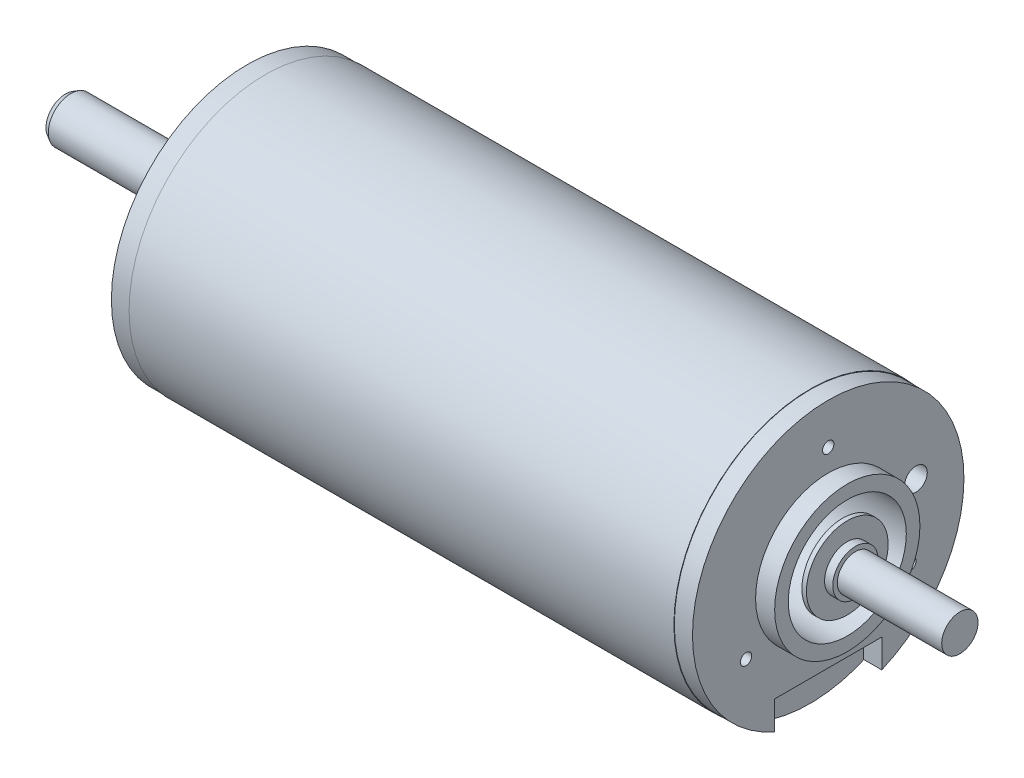
ISO-10303-21;
HEADER;
FILE_DESCRIPTION(('STEP AP214'),'2;1');
FILE_NAME('part.step','',(''),(''),'','','');
FILE_SCHEMA(('AUTOMOTIVE_DESIGN { 1 0 10303 214 1 1 1 1 }'));
ENDSEC;
DATA;
#1=APPLICATION_CONTEXT('core data for automotive mechanical design processes');
#2=APPLICATION_PROTOCOL_DEFINITION('international standard','automotive_design',2000,#1);
#3=PRODUCT_CONTEXT('',#1,'mechanical');
#4=PRODUCT('Part','Part','',(#3));
#5=PRODUCT_RELATED_PRODUCT_CATEGORY('part','',(#4));
#6=PRODUCT_DEFINITION_FORMATION('','',#4);
#7=PRODUCT_DEFINITION_CONTEXT('part definition',#1,'design');
#8=PRODUCT_DEFINITION('design','',#6,#7);
#9=PRODUCT_DEFINITION_SHAPE('','',#8);
#10=(LENGTH_UNIT() NAMED_UNIT(*) SI_UNIT(.MILLI.,.METRE.));
#11=(NAMED_UNIT(*) PLANE_ANGLE_UNIT() SI_UNIT($,.RADIAN.));
#12=(NAMED_UNIT(*) SI_UNIT($,.STERADIAN.) SOLID_ANGLE_UNIT());
#13=UNCERTAINTY_MEASURE_WITH_UNIT(LENGTH_MEASURE(1.E-05),#10,'distance_accuracy_value','');
#14=(GEOMETRIC_REPRESENTATION_CONTEXT(3) GLOBAL_UNCERTAINTY_ASSIGNED_CONTEXT((#13)) GLOBAL_UNIT_ASSIGNED_CONTEXT((#10,
#11,#12)) REPRESENTATION_CONTEXT('',''));
#15=CARTESIAN_POINT('',(0.,0.,0.));
#16=DIRECTION('',(0.,0.,1.));
#17=DIRECTION('',(1.,0.,0.));
#18=AXIS2_PLACEMENT_3D('',#15,#16,#17);
#19=CARTESIAN_POINT('',(78.5,0.,0.));
#20=DIRECTION('',(-1.,0.,0.));
#21=DIRECTION('',(0.,0.,1.));
#22=AXIS2_PLACEMENT_3D('',#19,#20,#21);
#23=CYLINDRICAL_SURFACE('',#22,2.);
#24=CARTESIAN_POINT('',(78.5,0.,0.));
#25=DIRECTION('',(-1.,0.,0.));
#26=DIRECTION('',(0.,0.,1.));
#27=AXIS2_PLACEMENT_3D('',#24,#25,#26);
#28=CIRCLE('',#27,2.);
#29=CARTESIAN_POINT('',(78.5,0.,2.));
#30=VERTEX_POINT('',#29);
#31=EDGE_CURVE('E11',#30,#30,#28,.T.);
#32=ORIENTED_EDGE('',*,*,#31,.T.);
#33=EDGE_LOOP('',(#32));
#34=FACE_BOUND('',#33,.T.);
#35=CARTESIAN_POINT('',(67.,0.,0.));
#36=DIRECTION('',(-1.,0.,0.));
#37=DIRECTION('',(0.,0.,1.));
#38=AXIS2_PLACEMENT_3D('',#35,#36,#37);
#39=CIRCLE('',#38,2.);
#40=CARTESIAN_POINT('',(67.,0.,2.));
#41=VERTEX_POINT('',#40);
#42=EDGE_CURVE('E63',#41,#41,#39,.T.);
#43=ORIENTED_EDGE('',*,*,#42,.F.);
#44=EDGE_LOOP('',(#43));
#45=FACE_BOUND('',#44,.T.);
#46=ADVANCED_FACE('F41',(#34,#45),#23,.T.);
#47=CARTESIAN_POINT('',(78.5,1.99999999999999,0.));
#48=DIRECTION('',(1.,0.,0.));
#49=DIRECTION('',(0.,0.,-1.));
#50=AXIS2_PLACEMENT_3D('',#47,#48,#49);
#51=PLANE('',#50);
#52=ORIENTED_EDGE('',*,*,#31,.F.);
#53=EDGE_LOOP('',(#52));
#54=FACE_BOUND('',#53,.T.);
#55=ADVANCED_FACE('F71',(#54),#51,.T.);
#56=CARTESIAN_POINT('',(65.6,0.,0.));
#57=DIRECTION('',(-1.,0.,0.));
#58=DIRECTION('',(0.,0.,1.));
#59=AXIS2_PLACEMENT_3D('',#56,#57,#58);
#60=PLANE('',#59);
#61=CARTESIAN_POINT('',(65.6,0.,0.));
#62=DIRECTION('',(-1.,0.,0.));
#63=DIRECTION('',(0.,0.,1.));
#64=AXIS2_PLACEMENT_3D('',#61,#62,#63);
#65=CIRCLE('',#64,4.5);
#66=CARTESIAN_POINT('',(65.6,0.,4.5));
#67=VERTEX_POINT('',#66);
#68=EDGE_CURVE('E47',#67,#67,#65,.T.);
#69=ORIENTED_EDGE('',*,*,#68,.T.);
#70=EDGE_LOOP('',(#69));
#71=FACE_BOUND('',#70,.T.);
#72=ADVANCED_FACE('F75',(#71),#60,.T.);
#73=CARTESIAN_POINT('',(78.5,0.,0.));
#74=DIRECTION('',(-1.,0.,0.));
#75=DIRECTION('',(0.,0.,1.));
#76=AXIS2_PLACEMENT_3D('',#73,#74,#75);
#77=CYLINDRICAL_SURFACE('',#76,4.5);
#78=CARTESIAN_POINT('',(66.1,0.,0.));
#79=DIRECTION('',(-1.,0.,0.));
#80=DIRECTION('',(0.,0.,1.));
#81=AXIS2_PLACEMENT_3D('',#78,#79,#80);
#82=CIRCLE('',#81,4.5);
#83=CARTESIAN_POINT('',(66.1,0.,4.5));
#84=VERTEX_POINT('',#83);
#85=EDGE_CURVE('E51',#84,#84,#82,.T.);
#86=ORIENTED_EDGE('',*,*,#85,.T.);
#87=EDGE_LOOP('',(#86));
#88=FACE_BOUND('',#87,.T.);
#89=ORIENTED_EDGE('',*,*,#68,.F.);
#90=EDGE_LOOP('',(#89));
#91=FACE_BOUND('',#90,.T.);
#92=ADVANCED_FACE('F80',(#88,#91),#77,.T.);
#93=CARTESIAN_POINT('',(66.1,4.49999999999999,0.));
#94=DIRECTION('',(1.,0.,0.));
#95=DIRECTION('',(0.,0.,-1.));
#96=AXIS2_PLACEMENT_3D('',#93,#94,#95);
#97=PLANE('',#96);
#98=CARTESIAN_POINT('',(66.1,0.,0.));
#99=DIRECTION('',(-1.,0.,0.));
#100=DIRECTION('',(0.,0.,1.));
#101=AXIS2_PLACEMENT_3D('',#98,#99,#100);
#102=CIRCLE('',#101,2.5);
#103=CARTESIAN_POINT('',(66.1,0.,2.5));
#104=VERTEX_POINT('',#103);
#105=EDGE_CURVE('E55',#104,#104,#102,.T.);
#106=ORIENTED_EDGE('',*,*,#105,.T.);
#107=EDGE_LOOP('',(#106));
#108=FACE_BOUND('',#107,.T.);
#109=ORIENTED_EDGE('',*,*,#85,.F.);
#110=EDGE_LOOP('',(#109));
#111=FACE_BOUND('',#110,.T.);
#112=ADVANCED_FACE('F85',(#108,#111),#97,.T.);
#113=CARTESIAN_POINT('',(78.5,0.,0.));
#114=DIRECTION('',(-1.,0.,0.));
#115=DIRECTION('',(0.,0.,1.));
#116=AXIS2_PLACEMENT_3D('',#113,#114,#115);
#117=CYLINDRICAL_SURFACE('',#116,2.5);
#118=CARTESIAN_POINT('',(67.,0.,0.));
#119=DIRECTION('',(-1.,0.,0.));
#120=DIRECTION('',(0.,0.,1.));
#121=AXIS2_PLACEMENT_3D('',#118,#119,#120);
#122=CIRCLE('',#121,2.5);
#123=CARTESIAN_POINT('',(67.,0.,2.5));
#124=VERTEX_POINT('',#123);
#125=EDGE_CURVE('E60',#124,#124,#122,.T.);
#126=ORIENTED_EDGE('',*,*,#125,.T.);
#127=EDGE_LOOP('',(#126));
#128=FACE_BOUND('',#127,.T.);
#129=ORIENTED_EDGE('',*,*,#105,.F.);
#130=EDGE_LOOP('',(#129));
#131=FACE_BOUND('',#130,.T.);
#132=ADVANCED_FACE('F89',(#128,#131),#117,.T.);
#133=CARTESIAN_POINT('',(67.,2.49999999999999,0.));
#134=DIRECTION('',(1.,0.,0.));
#135=DIRECTION('',(0.,0.,-1.));
#136=AXIS2_PLACEMENT_3D('',#133,#134,#135);
#137=PLANE('',#136);
#138=ORIENTED_EDGE('',*,*,#42,.T.);
#139=EDGE_LOOP('',(#138));
#140=FACE_BOUND('',#139,.T.);
#141=ORIENTED_EDGE('',*,*,#125,.F.);
#142=EDGE_LOOP('',(#141));
#143=FACE_BOUND('',#142,.T.);
#144=ADVANCED_FACE('F67',(#140,#143),#137,.T.);
#145=CLOSED_SHELL('',(#46,#55,#72,#92,#112,#132,#144));
#146=MANIFOLD_SOLID_BREP('B2',#145);
#147=CARTESIAN_POINT('',(-0.7000000000001,0.,0.));
#148=DIRECTION('',(-1.,0.,0.));
#149=DIRECTION('',(0.,0.,1.));
#150=AXIS2_PLACEMENT_3D('',#147,#148,#149);
#151=CYLINDRICAL_SURFACE('',#150,4.5);
#152=CARTESIAN_POINT('',(-0.700000000000103,0.,0.));
#153=DIRECTION('',(-1.,0.,0.));
#154=DIRECTION('',(0.,0.,1.));
#155=AXIS2_PLACEMENT_3D('',#152,#153,#154);
#156=CIRCLE('',#155,4.5);
#157=CARTESIAN_POINT('',(-0.700000000000103,0.,4.5));
#158=VERTEX_POINT('',#157);
#159=EDGE_CURVE('E161',#158,#158,#156,.T.);
#160=ORIENTED_EDGE('',*,*,#159,.T.);
#161=EDGE_LOOP('',(#160));
#162=FACE_BOUND('',#161,.T.);
#163=CARTESIAN_POINT('',(-1.20000000000001,0.,0.));
#164=DIRECTION('',(-1.,0.,0.));
#165=DIRECTION('',(0.,0.,1.));
#166=AXIS2_PLACEMENT_3D('',#163,#164,#165);
#167=CIRCLE('',#166,4.5);
#168=CARTESIAN_POINT('',(-1.20000000000001,0.,4.5));
#169=VERTEX_POINT('',#168);
#170=EDGE_CURVE('E170',#169,#169,#167,.T.);
#171=ORIENTED_EDGE('',*,*,#170,.F.);
#172=EDGE_LOOP('',(#171));
#173=FACE_BOUND('',#172,.T.);
#174=ADVANCED_FACE('F150',(#162,#173),#151,.T.);
#175=CARTESIAN_POINT('',(-0.700000000000102,4.49999999999999,0.));
#176=DIRECTION('',(1.,0.,0.));
#177=DIRECTION('',(0.,0.,-1.));
#178=AXIS2_PLACEMENT_3D('',#175,#176,#177);
#179=PLANE('',#178);
#180=ORIENTED_EDGE('',*,*,#159,.F.);
#181=EDGE_LOOP('',(#180));
#182=FACE_BOUND('',#181,.T.);
#183=ADVANCED_FACE('F178',(#182),#179,.T.);
#184=CARTESIAN_POINT('',(-20.,0.,0.));
#185=DIRECTION('',(-1.,0.,0.));
#186=DIRECTION('',(0.,0.,1.));
#187=AXIS2_PLACEMENT_3D('',#184,#185,#186);
#188=PLANE('',#187);
#189=CARTESIAN_POINT('',(-20.,0.,0.));
#190=DIRECTION('',(-1.,0.,0.));
#191=DIRECTION('',(0.,0.,1.));
#192=AXIS2_PLACEMENT_3D('',#189,#190,#191);
#193=CIRCLE('',#192,2.15358983850806);
#194=CARTESIAN_POINT('',(-20.,0.,-2.15358983850806));
#195=VERTEX_POINT('',#194);
#196=EDGE_CURVE('E157',#195,#195,#193,.T.);
#197=ORIENTED_EDGE('',*,*,#196,.T.);
#198=EDGE_LOOP('',(#197));
#199=FACE_BOUND('',#198,.T.);
#200=ADVANCED_FACE('F183',(#199),#188,.T.);
#201=CARTESIAN_POINT('',(-0.7000000000001,0.,0.));
#202=DIRECTION('',(-1.,0.,0.));
#203=DIRECTION('',(0.,0.,1.));
#204=AXIS2_PLACEMENT_3D('',#201,#202,#203);
#205=CYLINDRICAL_SURFACE('',#204,2.5);
#206=CARTESIAN_POINT('',(-19.4000000000153,0.,0.));
#207=DIRECTION('',(-1.,0.,0.));
#208=DIRECTION('',(0.,0.,1.));
#209=AXIS2_PLACEMENT_3D('',#206,#207,#208);
#210=CIRCLE('',#209,2.5);
#211=CARTESIAN_POINT('',(-19.4000000000153,0.,-2.5));
#212=VERTEX_POINT('',#211);
#213=EDGE_CURVE('E40',#212,#212,#210,.F.);
#214=ORIENTED_EDGE('',*,*,#213,.T.);
#215=EDGE_LOOP('',(#214));
#216=FACE_BOUND('',#215,.T.);
#217=CARTESIAN_POINT('',(-1.20000000000001,0.,0.));
#218=DIRECTION('',(-1.,0.,0.));
#219=DIRECTION('',(0.,0.,1.));
#220=AXIS2_PLACEMENT_3D('',#217,#218,#219);
#221=CIRCLE('',#220,2.5);
#222=CARTESIAN_POINT('',(-1.20000000000001,0.,2.5));
#223=VERTEX_POINT('',#222);
#224=EDGE_CURVE('E165',#223,#223,#221,.T.);
#225=ORIENTED_EDGE('',*,*,#224,.T.);
#226=EDGE_LOOP('',(#225));
#227=FACE_BOUND('',#226,.T.);
#228=ADVANCED_FACE('F189',(#216,#227),#205,.T.);
#229=CARTESIAN_POINT('',(-1.20000000000001,2.49999999999999,0.));
#230=DIRECTION('',(-1.,0.,0.));
#231=DIRECTION('',(0.,0.,1.));
#232=AXIS2_PLACEMENT_3D('',#229,#230,#231);
#233=PLANE('',#232);
#234=ORIENTED_EDGE('',*,*,#170,.T.);
#235=EDGE_LOOP('',(#234));
#236=FACE_BOUND('',#235,.T.);
#237=ORIENTED_EDGE('',*,*,#224,.F.);
#238=EDGE_LOOP('',(#237));
#239=FACE_BOUND('',#238,.T.);
#240=ADVANCED_FACE('F174',(#236,#239),#233,.T.);
#241=CARTESIAN_POINT('',(-20.,0.,0.));
#242=DIRECTION('',(1.,0.,0.));
#243=DIRECTION('',(0.,0.,-1.));
#244=AXIS2_PLACEMENT_3D('',#241,#242,#243);
#245=CONICAL_SURFACE('',#244,2.15358983850806,0.523598775582039);
#246=CARTESIAN_POINT('',(-19.4000000000153,0.,-2.5));
#247=CARTESIAN_POINT('',(-19.4062500000151,0.,-2.49639156081779));
#248=CARTESIAN_POINT('',(-19.412500000015,0.,-2.49278312163559));
#249=CARTESIAN_POINT('',(-19.4250000000147,0.,-2.48556624327117));
#250=CARTESIAN_POINT('',(-19.4312500000145,0.,-2.48195780408896));
#251=CARTESIAN_POINT('',(-19.4437500000142,0.,-2.47474092572455));
#252=CARTESIAN_POINT('',(-19.450000000014,0.,-2.47113248654234));
#253=CARTESIAN_POINT('',(-19.4625000000137,0.,-2.46391560817792));
#254=CARTESIAN_POINT('',(-19.4687500000135,0.,-2.46030716899572));
#255=CARTESIAN_POINT('',(-19.4812500000132,0.,-2.4530902906313));
#256=CARTESIAN_POINT('',(-19.4875000000131,0.,-2.44948185144909));
#257=CARTESIAN_POINT('',(-19.5000000000128,0.,-2.44226497308468));
#258=CARTESIAN_POINT('',(-19.5062500000126,0.,-2.43865653390247));
#259=CARTESIAN_POINT('',(-19.5187500000123,0.,-2.43143965553806));
#260=CARTESIAN_POINT('',(-19.5250000000121,0.,-2.42783121635585));
#261=CARTESIAN_POINT('',(-19.5375000000118,0.,-2.42061433799143));
#262=CARTESIAN_POINT('',(-19.5437500000116,0.,-2.41700589880922));
#263=CARTESIAN_POINT('',(-19.5562500000113,0.,-2.40978902044481));
#264=CARTESIAN_POINT('',(-19.5625000000112,0.,-2.4061805812626));
#265=CARTESIAN_POINT('',(-19.5750000000108,0.,-2.39896370289819));
#266=CARTESIAN_POINT('',(-19.5812500000107,0.,-2.39535526371598));
#267=CARTESIAN_POINT('',(-19.5937500000104,0.,-2.38813838535156));
#268=CARTESIAN_POINT('',(-19.6000000000102,0.,-2.38452994616936));
#269=CARTESIAN_POINT('',(-19.6125000000099,0.,-2.37731306780494));
#270=CARTESIAN_POINT('',(-19.6187500000097,0.,-2.37370462862273));
#271=CARTESIAN_POINT('',(-19.6312500000094,0.,-2.36648775025832));
#272=CARTESIAN_POINT('',(-19.6375000000092,0.,-2.36287931107611));
#273=CARTESIAN_POINT('',(-19.6500000000089,0.,-2.35566243271169));
#274=CARTESIAN_POINT('',(-19.6562500000088,0.,-2.35205399352949));
#275=CARTESIAN_POINT('',(-19.6687500000084,0.,-2.34483711516507));
#276=CARTESIAN_POINT('',(-19.6750000000083,0.,-2.34122867598286));
#277=CARTESIAN_POINT('',(-19.687500000008,0.,-2.33401179761845));
#278=CARTESIAN_POINT('',(-19.6937500000078,0.,-2.33040335843624));
#279=CARTESIAN_POINT('',(-19.7062500000075,0.,-2.32318648007183));
#280=CARTESIAN_POINT('',(-19.7125000000073,0.,-2.31957804088962));
#281=CARTESIAN_POINT('',(-19.725000000007,0.,-2.3123611625252));
#282=CARTESIAN_POINT('',(-19.7312500000069,0.,-2.30875272334299));
#283=CARTESIAN_POINT('',(-19.7437500000065,0.,-2.30153584497858));
#284=CARTESIAN_POINT('',(-19.7500000000064,0.,-2.29792740579637));
#285=CARTESIAN_POINT('',(-19.7625000000061,0.,-2.29071052743196));
#286=CARTESIAN_POINT('',(-19.7687500000059,0.,-2.28710208824975));
#287=CARTESIAN_POINT('',(-19.7812500000056,0.,-2.27988520988533));
#288=CARTESIAN_POINT('',(-19.7875000000054,0.,-2.27627677070313));
#289=CARTESIAN_POINT('',(-19.8000000000051,0.,-2.26905989233871));
#290=CARTESIAN_POINT('',(-19.8062500000049,0.,-2.2654514531565));
#291=CARTESIAN_POINT('',(-19.8187500000046,0.,-2.25823457479209));
#292=CARTESIAN_POINT('',(-19.8250000000045,0.,-2.25462613560988));
#293=CARTESIAN_POINT('',(-19.8375000000041,0.,-2.24740925724546));
#294=CARTESIAN_POINT('',(-19.843750000004,0.,-2.24380081806326));
#295=CARTESIAN_POINT('',(-19.8562500000037,0.,-2.23658393969884));
#296=CARTESIAN_POINT('',(-19.8625000000035,0.,-2.23297550051663));
#297=CARTESIAN_POINT('',(-19.8750000000032,0.,-2.22575862215222));
#298=CARTESIAN_POINT('',(-19.881250000003,0.,-2.22215018297001));
#299=CARTESIAN_POINT('',(-19.8937500000027,0.,-2.2149333046056));
#300=CARTESIAN_POINT('',(-19.9000000000025,0.,-2.21132486542339));
#301=CARTESIAN_POINT('',(-19.9125000000022,0.,-2.20410798705897));
#302=CARTESIAN_POINT('',(-19.9187500000021,0.,-2.20049954787676));
#303=CARTESIAN_POINT('',(-19.9312500000018,0.,-2.19328266951235));
#304=CARTESIAN_POINT('',(-19.9375000000016,0.,-2.18967423033014));
#305=CARTESIAN_POINT('',(-19.9500000000013,0.,-2.18245735196573));
#306=CARTESIAN_POINT('',(-19.9562500000011,0.,-2.17884891278352));
#307=CARTESIAN_POINT('',(-19.9687500000008,0.,-2.1716320344191));
#308=CARTESIAN_POINT('',(-19.9750000000006,0.,-2.1680235952369));
#309=CARTESIAN_POINT('',(-19.9875000000003,0.,-2.16080671687248));
#310=CARTESIAN_POINT('',(-19.9937500000002,0.,-2.15719827769027));
#311=CARTESIAN_POINT('',(-20.,0.,-2.15358983850806));
#312=B_SPLINE_CURVE_WITH_KNOTS('',3,(#246,#247,#248,#249,#250,#251,#252,#253,#254,#255,#256,
#257,#258,#259,#260,#261,#262,#263,#264,#265,#266,#267,#268,#269,#270,#271,#272,#273,#274,#275,
#276,#277,#278,#279,#280,#281,#282,#283,#284,#285,#286,#287,#288,#289,#290,#291,#292,#293,#294,
#295,#296,#297,#298,#299,#300,#301,#302,#303,#304,#305,#306,#307,#308,#309,#310,#311),
.UNSPECIFIED.,.F.,.F.,(4,2,2,2,2,2,2,2,2,2,2,2,2,2,2,2,2,2,2,2,2,2,2,2,2,2,2,2,2,2,2,2,4),(0.,
0.0216506350938563,0.0433012701877126,0.0649519052815689,0.0866025403754252,0.108253175469282,
0.129903810563135,0.151554445656991,0.173205080750847,0.194855715844704,0.21650635093856,
0.238156986032413,0.25980762112627,0.281458256220126,0.303108891313982,0.324759526407839,
0.346410161501692,0.368060796595548,0.389711431689405,0.411362066783261,0.433012701877117,
0.454663336970973,0.476313972064827,0.497964607158683,0.519615242252539,0.541265877346396,
0.562916512440252,0.584567147534105,0.606217782627962,0.627868417721818,0.649519052815674,
0.671169687909531,0.692820323003387),.UNSPECIFIED.);
#313=EDGE_CURVE('BSEAM152',#212,#195,#312,.T.);
#314=ORIENTED_EDGE('',*,*,#213,.F.);
#315=ORIENTED_EDGE('',*,*,#196,.F.);
#316=ORIENTED_EDGE('',*,*,#313,.T.);
#317=ORIENTED_EDGE('',*,*,#313,.F.);
#318=EDGE_LOOP('',(#314,#316,#315,#317));
#319=FACE_BOUND('',#318,.T.);
#320=ADVANCED_FACE('F152',(#319),#245,.T.);
#321=CLOSED_SHELL('',(#174,#183,#200,#228,#240,#320));
#322=MANIFOLD_SOLID_BREP('B6',#321);
#323=CARTESIAN_POINT('',(0.,0.,0.));
#324=DIRECTION('',(-1.,0.,0.));
#325=DIRECTION('',(0.,0.,1.));
#326=AXIS2_PLACEMENT_3D('',#323,#324,#325);
#327=PLANE('',#326);
#328=CARTESIAN_POINT('',(0.,-11.,0.));
#329=DIRECTION('',(-1.,0.,0.));
#330=DIRECTION('',(0.,0.,1.));
#331=AXIS2_PLACEMENT_3D('',#328,#329,#330);
#332=CIRCLE('',#331,1.25);
#333=CARTESIAN_POINT('',(0.,-11.,1.25));
#334=VERTEX_POINT('',#333);
#335=EDGE_CURVE('E329',#334,#334,#332,.T.);
#336=ORIENTED_EDGE('',*,*,#335,.F.);
#337=EDGE_LOOP('',(#336));
#338=FACE_BOUND('',#337,.T.);
#339=CARTESIAN_POINT('',(0.,0.,-11.));
#340=DIRECTION('',(-1.,0.,0.));
#341=DIRECTION('',(0.,0.,1.));
#342=AXIS2_PLACEMENT_3D('',#339,#340,#341);
#343=CIRCLE('',#342,1.25);
#344=CARTESIAN_POINT('',(0.,0.,-9.75));
#345=VERTEX_POINT('',#344);
#346=EDGE_CURVE('E335',#345,#345,#343,.T.);
#347=ORIENTED_EDGE('',*,*,#346,.F.);
#348=EDGE_LOOP('',(#347));
#349=FACE_BOUND('',#348,.T.);
#350=CARTESIAN_POINT('',(0.,11.,0.));
#351=DIRECTION('',(-1.,0.,0.));
#352=DIRECTION('',(0.,0.,1.));
#353=AXIS2_PLACEMENT_3D('',#350,#351,#352);
#354=CIRCLE('',#353,1.25);
#355=CARTESIAN_POINT('',(0.,11.,1.25));
#356=VERTEX_POINT('',#355);
#357=EDGE_CURVE('E341',#356,#356,#354,.T.);
#358=ORIENTED_EDGE('',*,*,#357,.F.);
#359=EDGE_LOOP('',(#358));
#360=FACE_BOUND('',#359,.T.);
#361=CARTESIAN_POINT('',(0.,0.,11.));
#362=DIRECTION('',(-1.,0.,0.));
#363=DIRECTION('',(0.,0.,1.));
#364=AXIS2_PLACEMENT_3D('',#361,#362,#363);
#365=CIRCLE('',#364,1.25);
#366=CARTESIAN_POINT('',(0.,0.,12.25));
#367=VERTEX_POINT('',#366);
#368=EDGE_CURVE('E347',#367,#367,#365,.T.);
#369=ORIENTED_EDGE('',*,*,#368,.F.);
#370=EDGE_LOOP('',(#369));
#371=FACE_BOUND('',#370,.T.);
#372=CARTESIAN_POINT('',(0.,-5.,8.660254037844));
#373=DIRECTION('',(-1.,0.,0.));
#374=DIRECTION('',(0.,0.,1.));
#375=AXIS2_PLACEMENT_3D('',#372,#373,#374);
#376=CIRCLE('',#375,1.25000000000001);
#377=CARTESIAN_POINT('',(0.,-5.,9.91025403784401));
#378=VERTEX_POINT('',#377);
#379=EDGE_CURVE('E359',#378,#378,#376,.T.);
#380=ORIENTED_EDGE('',*,*,#379,.F.);
#381=EDGE_LOOP('',(#380));
#382=FACE_BOUND('',#381,.T.);
#383=CARTESIAN_POINT('',(0.,0.,0.));
#384=DIRECTION('',(-1.,0.,0.));
#385=DIRECTION('',(0.,0.,1.));
#386=AXIS2_PLACEMENT_3D('',#383,#384,#385);
#387=CIRCLE('',#386,14.95);
#388=CARTESIAN_POINT('',(0.,0.,14.95));
#389=VERTEX_POINT('',#388);
#390=EDGE_CURVE('E375',#389,#389,#387,.T.);
#391=ORIENTED_EDGE('',*,*,#390,.T.);
#392=EDGE_LOOP('',(#391));
#393=FACE_BOUND('',#392,.T.);
#394=CARTESIAN_POINT('',(0.,0.,0.));
#395=DIRECTION('',(-1.,0.,0.));
#396=DIRECTION('',(0.,0.,1.));
#397=AXIS2_PLACEMENT_3D('',#394,#395,#396);
#398=CIRCLE('',#397,8.);
#399=CARTESIAN_POINT('',(0.,0.,8.));
#400=VERTEX_POINT('',#399);
#401=EDGE_CURVE('E368',#400,#400,#398,.T.);
#402=ORIENTED_EDGE('',*,*,#401,.F.);
#403=EDGE_LOOP('',(#402));
#404=FACE_BOUND('',#403,.T.);
#405=ADVANCED_FACE('F235',(#338,#349,#360,#371,#382,#393,#404),#327,.T.);
#406=CARTESIAN_POINT('',(2.,0.,0.));
#407=DIRECTION('',(-1.,0.,0.));
#408=DIRECTION('',(0.,0.,1.));
#409=AXIS2_PLACEMENT_3D('',#406,#407,#408);
#410=PLANE('',#409);
#411=CARTESIAN_POINT('',(2.,0.,0.));
#412=DIRECTION('',(-1.,0.,0.));
#413=DIRECTION('',(0.,0.,1.));
#414=AXIS2_PLACEMENT_3D('',#411,#412,#413);
#415=CIRCLE('',#414,15.);
#416=CARTESIAN_POINT('',(2.,0.,15.));
#417=VERTEX_POINT('',#416);
#418=EDGE_CURVE('E408',#417,#417,#415,.T.);
#419=ORIENTED_EDGE('',*,*,#418,.T.);
#420=EDGE_LOOP('',(#419));
#421=FACE_BOUND('',#420,.T.);
#422=CARTESIAN_POINT('',(2.,0.,0.));
#423=DIRECTION('',(-1.,0.,0.));
#424=DIRECTION('',(0.,0.,1.));
#425=AXIS2_PLACEMENT_3D('',#422,#423,#424);
#426=CIRCLE('',#425,14.95);
#427=CARTESIAN_POINT('',(2.,0.,14.95));
#428=VERTEX_POINT('',#427);
#429=EDGE_CURVE('E372',#428,#428,#426,.T.);
#430=ORIENTED_EDGE('',*,*,#429,.F.);
#431=EDGE_LOOP('',(#430));
#432=FACE_BOUND('',#431,.T.);
#433=ADVANCED_FACE('F445',(#421,#432),#410,.T.);
#434=CARTESIAN_POINT('',(64.,0.,0.));
#435=DIRECTION('',(-1.,0.,0.));
#436=DIRECTION('',(0.,0.,1.));
#437=AXIS2_PLACEMENT_3D('',#434,#435,#436);
#438=PLANE('',#437);
#439=CARTESIAN_POINT('',(64.,-5.225,9.049965469547));
#440=DIRECTION('',(1.,0.,0.));
#441=DIRECTION('',(0.,0.,-1.));
#442=AXIS2_PLACEMENT_3D('',#439,#440,#441);
#443=CIRCLE('',#442,0.625000000000001);
#444=CARTESIAN_POINT('',(64.,-5.225,8.424965469547));
#445=VERTEX_POINT('',#444);
#446=EDGE_CURVE('E313',#445,#445,#443,.T.);
#447=ORIENTED_EDGE('',*,*,#446,.F.);
#448=EDGE_LOOP('',(#447));
#449=FACE_BOUND('',#448,.T.);
#450=CARTESIAN_POINT('',(64.,-5.225,-9.049965469547));
#451=DIRECTION('',(1.,0.,0.));
#452=DIRECTION('',(0.,0.,-1.));
#453=AXIS2_PLACEMENT_3D('',#450,#451,#452);
#454=CIRCLE('',#453,0.625000000000001);
#455=CARTESIAN_POINT('',(64.,-5.225,-9.674965469547));
#456=VERTEX_POINT('',#455);
#457=EDGE_CURVE('E312',#456,#456,#454,.T.);
#458=ORIENTED_EDGE('',*,*,#457,.F.);
#459=EDGE_LOOP('',(#458));
#460=FACE_BOUND('',#459,.T.);
#461=CARTESIAN_POINT('',(64.,10.45,0.));
#462=DIRECTION('',(1.,0.,0.));
#463=DIRECTION('',(0.,0.,-1.));
#464=AXIS2_PLACEMENT_3D('',#461,#462,#463);
#465=CIRCLE('',#464,0.625000000000001);
#466=CARTESIAN_POINT('',(64.,10.45,-0.625000000000001));
#467=VERTEX_POINT('',#466);
#468=EDGE_CURVE('E323',#467,#467,#465,.T.);
#469=ORIENTED_EDGE('',*,*,#468,.F.);
#470=EDGE_LOOP('',(#469));
#471=FACE_BOUND('',#470,.T.);
#472=CARTESIAN_POINT('',(64.,2.588190451025,-9.659258262891));
#473=DIRECTION('',(1.,0.,0.));
#474=DIRECTION('',(0.,0.,-1.));
#475=AXIS2_PLACEMENT_3D('',#472,#473,#474);
#476=CIRCLE('',#475,1.25000000000001);
#477=CARTESIAN_POINT('',(64.,2.588190451025,-10.909258262891));
#478=VERTEX_POINT('',#477);
#479=EDGE_CURVE('E353',#478,#478,#476,.T.);
#480=ORIENTED_EDGE('',*,*,#479,.F.);
#481=EDGE_LOOP('',(#480));
#482=FACE_BOUND('',#481,.T.);
#483=CARTESIAN_POINT('',(64.,0.,0.));
#484=DIRECTION('',(1.,0.,0.));
#485=DIRECTION('',(0.,0.,1.));
#486=AXIS2_PLACEMENT_3D('',#483,#484,#485);
#487=CIRCLE('',#486,14.9500000000016);
#488=CARTESIAN_POINT('',(64.,-13.7365388653783,-5.9));
#489=VERTEX_POINT('',#488);
#490=CARTESIAN_POINT('',(64.,-13.7365388653783,5.9));
#491=VERTEX_POINT('',#490);
#492=EDGE_CURVE('E387',#489,#491,#487,.T.);
#493=ORIENTED_EDGE('',*,*,#492,.T.);
#494=DIRECTION('',(0.,1.,0.));
#495=VECTOR('',#494,1.);
#496=CARTESIAN_POINT('',(64.,-10.6,5.9));
#497=LINE('',#496,#495);
#498=CARTESIAN_POINT('',(64.,-10.6,5.9));
#499=VERTEX_POINT('',#498);
#500=EDGE_CURVE('E280',#491,#499,#497,.T.);
#501=ORIENTED_EDGE('',*,*,#500,.T.);
#502=DIRECTION('',(0.,0.,-1.));
#503=VECTOR('',#502,1.);
#504=CARTESIAN_POINT('',(64.,-10.6,-5.9));
#505=LINE('',#504,#503);
#506=CARTESIAN_POINT('',(64.,-10.6,-5.9));
#507=VERTEX_POINT('',#506);
#508=EDGE_CURVE('E390',#499,#507,#505,.T.);
#509=ORIENTED_EDGE('',*,*,#508,.T.);
#510=DIRECTION('',(0.,-1.,0.));
#511=VECTOR('',#510,1.);
#512=CARTESIAN_POINT('',(64.,-13.7365388653783,-5.9));
#513=LINE('',#512,#511);
#514=EDGE_CURVE('E258',#507,#489,#513,.T.);
#515=ORIENTED_EDGE('',*,*,#514,.T.);
#516=EDGE_LOOP('',(#493,#501,#509,#515));
#517=FACE_BOUND('',#516,.T.);
#518=CARTESIAN_POINT('',(64.,0.,0.));
#519=DIRECTION('',(-1.,0.,0.));
#520=DIRECTION('',(0.,0.,1.));
#521=AXIS2_PLACEMENT_3D('',#518,#519,#520);
#522=CIRCLE('',#521,8.);
#523=CARTESIAN_POINT('',(64.,0.,8.));
#524=VERTEX_POINT('',#523);
#525=EDGE_CURVE('E148',#524,#524,#522,.F.);
#526=ORIENTED_EDGE('',*,*,#525,.F.);
#527=EDGE_LOOP('',(#526));
#528=FACE_BOUND('',#527,.T.);
#529=ADVANCED_FACE('F418',(#449,#460,#471,#482,#517,#528),#438,.F.);
#530=CARTESIAN_POINT('',(62.,15.,0.));
#531=DIRECTION('',(1.,0.,0.));
#532=DIRECTION('',(0.,0.,-1.));
#533=AXIS2_PLACEMENT_3D('',#530,#531,#532);
#534=PLANE('',#533);
#535=CARTESIAN_POINT('',(62.,0.,0.));
#536=DIRECTION('',(-1.,0.,0.));
#537=DIRECTION('',(0.,0.,1.));
#538=AXIS2_PLACEMENT_3D('',#535,#536,#537);
#539=CIRCLE('',#538,15.);
#540=CARTESIAN_POINT('',(62.,0.,15.));
#541=VERTEX_POINT('',#540);
#542=EDGE_CURVE('E243',#541,#541,#539,.T.);
#543=ORIENTED_EDGE('',*,*,#542,.F.);
#544=EDGE_LOOP('',(#543));
#545=FACE_BOUND('',#544,.T.);
#546=DIRECTION('',(0.,1.,0.));
#547=VECTOR('',#546,1.);
#548=CARTESIAN_POINT('',(62.,-10.6,5.9));
#549=LINE('',#548,#547);
#550=CARTESIAN_POINT('',(62.,-13.7365388653783,5.9));
#551=VERTEX_POINT('',#550);
#552=CARTESIAN_POINT('',(62.,-10.6,5.9));
#553=VERTEX_POINT('',#552);
#554=EDGE_CURVE('E396',#551,#553,#549,.T.);
#555=ORIENTED_EDGE('',*,*,#554,.F.);
#556=CARTESIAN_POINT('',(62.,0.,0.));
#557=DIRECTION('',(1.,0.,0.));
#558=DIRECTION('',(0.,0.,1.));
#559=AXIS2_PLACEMENT_3D('',#556,#557,#558);
#560=CIRCLE('',#559,14.9500000000016);
#561=CARTESIAN_POINT('',(62.,-13.7365388653783,-5.9));
#562=VERTEX_POINT('',#561);
#563=EDGE_CURVE('E386',#562,#551,#560,.T.);
#564=ORIENTED_EDGE('',*,*,#563,.F.);
#565=DIRECTION('',(0.,-1.,0.));
#566=VECTOR('',#565,1.);
#567=CARTESIAN_POINT('',(62.,-13.7365388653783,-5.9));
#568=LINE('',#567,#566);
#569=CARTESIAN_POINT('',(62.,-10.6,-5.9));
#570=VERTEX_POINT('',#569);
#571=EDGE_CURVE('E273',#570,#562,#568,.T.);
#572=ORIENTED_EDGE('',*,*,#571,.F.);
#573=DIRECTION('',(0.,0.,-1.));
#574=VECTOR('',#573,1.);
#575=CARTESIAN_POINT('',(62.,-10.6,-5.9));
#576=LINE('',#575,#574);
#577=EDGE_CURVE('E398',#553,#570,#576,.T.);
#578=ORIENTED_EDGE('',*,*,#577,.F.);
#579=EDGE_LOOP('',(#555,#564,#572,#578));
#580=FACE_BOUND('',#579,.T.);
#581=ADVANCED_FACE('F415',(#545,#580),#534,.T.);
#582=CARTESIAN_POINT('',(62.,0.,0.));
#583=DIRECTION('',(-1.,0.,0.));
#584=DIRECTION('',(0.,0.,1.));
#585=AXIS2_PLACEMENT_3D('',#582,#583,#584);
#586=CYLINDRICAL_SURFACE('',#585,15.);
#587=ORIENTED_EDGE('',*,*,#542,.T.);
#588=EDGE_LOOP('',(#587));
#589=FACE_BOUND('',#588,.T.);
#590=ORIENTED_EDGE('',*,*,#418,.F.);
#591=EDGE_LOOP('',(#590));
#592=FACE_BOUND('',#591,.T.);
#593=ADVANCED_FACE('F237',(#589,#592),#586,.T.);
#594=CARTESIAN_POINT('',(64.,0.,0.));
#595=DIRECTION('',(-1.,0.,0.));
#596=DIRECTION('',(0.,0.,1.));
#597=AXIS2_PLACEMENT_3D('',#594,#595,#596);
#598=CYLINDRICAL_SURFACE('',#597,14.9500000000016);
#599=ORIENTED_EDGE('',*,*,#563,.T.);
#600=DIRECTION('',(-1.,0.,0.));
#601=VECTOR('',#600,1.);
#602=CARTESIAN_POINT('',(64.,-13.7365388653783,5.9));
#603=LINE('',#602,#601);
#604=EDGE_CURVE('E406',#491,#551,#603,.T.);
#605=ORIENTED_EDGE('',*,*,#604,.F.);
#606=ORIENTED_EDGE('',*,*,#492,.F.);
#607=DIRECTION('',(-1.,0.,0.));
#608=VECTOR('',#607,1.);
#609=CARTESIAN_POINT('',(64.,-13.7365388653783,-5.9));
#610=LINE('',#609,#608);
#611=EDGE_CURVE('E393',#489,#562,#610,.T.);
#612=ORIENTED_EDGE('',*,*,#611,.T.);
#613=EDGE_LOOP('',(#599,#605,#606,#612));
#614=FACE_BOUND('',#613,.T.);
#615=ADVANCED_FACE('F430',(#614),#598,.T.);
#616=CARTESIAN_POINT('',(64.,-10.6,5.9));
#617=DIRECTION('',(0.,0.,1.));
#618=DIRECTION('',(1.,0.,0.));
#619=AXIS2_PLACEMENT_3D('',#616,#617,#618);
#620=PLANE('',#619);
#621=ORIENTED_EDGE('',*,*,#554,.T.);
#622=DIRECTION('',(-1.,0.,0.));
#623=VECTOR('',#622,1.);
#624=CARTESIAN_POINT('',(64.,-10.6,5.9));
#625=LINE('',#624,#623);
#626=EDGE_CURVE('E403',#499,#553,#625,.T.);
#627=ORIENTED_EDGE('',*,*,#626,.F.);
#628=ORIENTED_EDGE('',*,*,#500,.F.);
#629=ORIENTED_EDGE('',*,*,#604,.T.);
#630=EDGE_LOOP('',(#621,#627,#628,#629));
#631=FACE_BOUND('',#630,.T.);
#632=ADVANCED_FACE('F422',(#631),#620,.F.);
#633=CARTESIAN_POINT('',(64.,-10.6,-5.9));
#634=DIRECTION('',(0.,1.,0.));
#635=DIRECTION('',(0.,0.,1.));
#636=AXIS2_PLACEMENT_3D('',#633,#634,#635);
#637=PLANE('',#636);
#638=ORIENTED_EDGE('',*,*,#577,.T.);
#639=DIRECTION('',(-1.,0.,0.));
#640=VECTOR('',#639,1.);
#641=CARTESIAN_POINT('',(64.,-10.6,-5.9));
#642=LINE('',#641,#640);
#643=EDGE_CURVE('E250',#507,#570,#642,.T.);
#644=ORIENTED_EDGE('',*,*,#643,.F.);
#645=ORIENTED_EDGE('',*,*,#508,.F.);
#646=ORIENTED_EDGE('',*,*,#626,.T.);
#647=EDGE_LOOP('',(#638,#644,#645,#646));
#648=FACE_BOUND('',#647,.T.);
#649=ADVANCED_FACE('F426',(#648),#637,.F.);
#650=CARTESIAN_POINT('',(64.,-13.7365388653783,-5.9));
#651=DIRECTION('',(0.,0.,-1.));
#652=DIRECTION('',(-1.,0.,0.));
#653=AXIS2_PLACEMENT_3D('',#650,#651,#652);
#654=PLANE('',#653);
#655=ORIENTED_EDGE('',*,*,#571,.T.);
#656=ORIENTED_EDGE('',*,*,#611,.F.);
#657=ORIENTED_EDGE('',*,*,#514,.F.);
#658=ORIENTED_EDGE('',*,*,#643,.T.);
#659=EDGE_LOOP('',(#655,#656,#657,#658));
#660=FACE_BOUND('',#659,.T.);
#661=ADVANCED_FACE('F431',(#660),#654,.F.);
#662=CARTESIAN_POINT('',(66.1,0.,0.));
#663=DIRECTION('',(-1.,0.,0.));
#664=DIRECTION('',(0.,0.,1.));
#665=AXIS2_PLACEMENT_3D('',#662,#663,#664);
#666=CYLINDRICAL_SURFACE('',#665,8.);
#667=CARTESIAN_POINT('',(66.1,0.,0.));
#668=DIRECTION('',(1.,0.,0.));
#669=DIRECTION('',(0.,0.,-1.));
#670=AXIS2_PLACEMENT_3D('',#667,#668,#669);
#671=CIRCLE('',#670,8.);
#672=CARTESIAN_POINT('',(66.1,0.,-8.));
#673=VERTEX_POINT('',#672);
#674=EDGE_CURVE('E383',#673,#673,#671,.T.);
#675=ORIENTED_EDGE('',*,*,#674,.F.);
#676=EDGE_LOOP('',(#675));
#677=FACE_BOUND('',#676,.T.);
#678=ORIENTED_EDGE('',*,*,#525,.T.);
#679=EDGE_LOOP('',(#678));
#680=FACE_BOUND('',#679,.T.);
#681=ADVANCED_FACE('F433',(#677,#680),#666,.T.);
#682=CARTESIAN_POINT('',(66.1,0.,0.));
#683=DIRECTION('',(1.,0.,0.));
#684=DIRECTION('',(0.,0.,-1.));
#685=AXIS2_PLACEMENT_3D('',#682,#683,#684);
#686=PLANE('',#685);
#687=CARTESIAN_POINT('',(66.1,0.,0.));
#688=DIRECTION('',(1.,0.,0.));
#689=DIRECTION('',(0.,0.,-1.));
#690=AXIS2_PLACEMENT_3D('',#687,#688,#689);
#691=CIRCLE('',#690,6.50000000000001);
#692=CARTESIAN_POINT('',(66.1,0.,-6.50000000000001));
#693=VERTEX_POINT('',#692);
#694=EDGE_CURVE('E378',#693,#693,#691,.T.);
#695=ORIENTED_EDGE('',*,*,#694,.F.);
#696=EDGE_LOOP('',(#695));
#697=FACE_BOUND('',#696,.T.);
#698=ORIENTED_EDGE('',*,*,#674,.T.);
#699=EDGE_LOOP('',(#698));
#700=FACE_BOUND('',#699,.T.);
#701=ADVANCED_FACE('F439',(#697,#700),#686,.T.);
#702=CARTESIAN_POINT('',(66.1,0.,0.));
#703=DIRECTION('',(1.,0.,0.));
#704=DIRECTION('',(0.,0.,-1.));
#705=AXIS2_PLACEMENT_3D('',#702,#703,#704);
#706=CYLINDRICAL_SURFACE('',#705,6.50000000000001);
#707=ORIENTED_EDGE('',*,*,#694,.T.);
#708=EDGE_LOOP('',(#707));
#709=FACE_BOUND('',#708,.T.);
#710=CARTESIAN_POINT('',(-1.2,0.,0.));
#711=DIRECTION('',(-1.,0.,0.));
#712=DIRECTION('',(0.,0.,1.));
#713=AXIS2_PLACEMENT_3D('',#710,#711,#712);
#714=CIRCLE('',#713,6.50000000000001);
#715=CARTESIAN_POINT('',(-1.2,0.,6.50000000000001));
#716=VERTEX_POINT('',#715);
#717=EDGE_CURVE('E365',#716,#716,#714,.T.);
#718=ORIENTED_EDGE('',*,*,#717,.T.);
#719=EDGE_LOOP('',(#718));
#720=FACE_BOUND('',#719,.T.);
#721=ADVANCED_FACE('F462',(#709,#720),#706,.F.);
#722=CARTESIAN_POINT('',(0.,0.,0.));
#723=DIRECTION('',(1.,0.,0.));
#724=DIRECTION('',(0.,0.,-1.));
#725=AXIS2_PLACEMENT_3D('',#722,#723,#724);
#726=CYLINDRICAL_SURFACE('',#725,14.95);
#727=ORIENTED_EDGE('',*,*,#390,.F.);
#728=EDGE_LOOP('',(#727));
#729=FACE_BOUND('',#728,.T.);
#730=ORIENTED_EDGE('',*,*,#429,.T.);
#731=EDGE_LOOP('',(#730));
#732=FACE_BOUND('',#731,.T.);
#733=ADVANCED_FACE('F459',(#729,#732),#726,.T.);
#734=CARTESIAN_POINT('',(-1.2,0.,0.));
#735=DIRECTION('',(1.,0.,0.));
#736=DIRECTION('',(0.,0.,-1.));
#737=AXIS2_PLACEMENT_3D('',#734,#735,#736);
#738=CYLINDRICAL_SURFACE('',#737,8.);
#739=CARTESIAN_POINT('',(-1.2,0.,0.));
#740=DIRECTION('',(-1.,0.,0.));
#741=DIRECTION('',(0.,0.,1.));
#742=AXIS2_PLACEMENT_3D('',#739,#740,#741);
#743=CIRCLE('',#742,8.);
#744=CARTESIAN_POINT('',(-1.2,0.,8.));
#745=VERTEX_POINT('',#744);
#746=EDGE_CURVE('E369',#745,#745,#743,.T.);
#747=ORIENTED_EDGE('',*,*,#746,.F.);
#748=EDGE_LOOP('',(#747));
#749=FACE_BOUND('',#748,.T.);
#750=ORIENTED_EDGE('',*,*,#401,.T.);
#751=EDGE_LOOP('',(#750));
#752=FACE_BOUND('',#751,.T.);
#753=ADVANCED_FACE('F457',(#749,#752),#738,.T.);
#754=CARTESIAN_POINT('',(-1.2,0.,0.));
#755=DIRECTION('',(-1.,0.,0.));
#756=DIRECTION('',(0.,0.,1.));
#757=AXIS2_PLACEMENT_3D('',#754,#755,#756);
#758=PLANE('',#757);
#759=ORIENTED_EDGE('',*,*,#717,.F.);
#760=EDGE_LOOP('',(#759));
#761=FACE_BOUND('',#760,.T.);
#762=ORIENTED_EDGE('',*,*,#746,.T.);
#763=EDGE_LOOP('',(#762));
#764=FACE_BOUND('',#763,.T.);
#765=ADVANCED_FACE('F505',(#761,#764),#758,.T.);
#766=CARTESIAN_POINT('',(2.,-5.,8.660254037844));
#767=DIRECTION('',(1.,0.,0.));
#768=DIRECTION('',(0.,0.,-1.));
#769=AXIS2_PLACEMENT_3D('',#766,#767,#768);
#770=PLANE('',#769);
#771=CARTESIAN_POINT('',(2.,-5.,8.660254037844));
#772=DIRECTION('',(-1.,0.,0.));
#773=DIRECTION('',(0.,0.,1.));
#774=AXIS2_PLACEMENT_3D('',#771,#772,#773);
#775=CIRCLE('',#774,1.25000000000001);
#776=CARTESIAN_POINT('',(2.,-5.,9.91025403784401));
#777=VERTEX_POINT('',#776);
#778=EDGE_CURVE('E362',#777,#777,#775,.T.);
#779=ORIENTED_EDGE('',*,*,#778,.T.);
#780=EDGE_LOOP('',(#779));
#781=FACE_BOUND('',#780,.T.);
#782=ADVANCED_FACE('F502',(#781),#770,.F.);
#783=CARTESIAN_POINT('',(0.,-5.,8.660254037844));
#784=DIRECTION('',(-1.,0.,0.));
#785=DIRECTION('',(0.,0.,1.));
#786=AXIS2_PLACEMENT_3D('',#783,#784,#785);
#787=CYLINDRICAL_SURFACE('',#786,1.25000000000001);
#788=ORIENTED_EDGE('',*,*,#778,.F.);
#789=EDGE_LOOP('',(#788));
#790=FACE_BOUND('',#789,.T.);
#791=ORIENTED_EDGE('',*,*,#379,.T.);
#792=EDGE_LOOP('',(#791));
#793=FACE_BOUND('',#792,.T.);
#794=ADVANCED_FACE('F494',(#790,#793),#787,.F.);
#795=CARTESIAN_POINT('',(62.,2.588190451025,-9.659258262891));
#796=DIRECTION('',(-1.,0.,0.));
#797=DIRECTION('',(0.,0.,1.));
#798=AXIS2_PLACEMENT_3D('',#795,#796,#797);
#799=PLANE('',#798);
#800=CARTESIAN_POINT('',(62.,2.588190451025,-9.659258262891));
#801=DIRECTION('',(1.,0.,0.));
#802=DIRECTION('',(0.,0.,-1.));
#803=AXIS2_PLACEMENT_3D('',#800,#801,#802);
#804=CIRCLE('',#803,1.25000000000001);
#805=CARTESIAN_POINT('',(62.,2.588190451025,-10.909258262891));
#806=VERTEX_POINT('',#805);
#807=EDGE_CURVE('E356',#806,#806,#804,.T.);
#808=ORIENTED_EDGE('',*,*,#807,.T.);
#809=EDGE_LOOP('',(#808));
#810=FACE_BOUND('',#809,.T.);
#811=ADVANCED_FACE('F484',(#810),#799,.F.);
#812=CARTESIAN_POINT('',(64.,2.588190451025,-9.659258262891));
#813=DIRECTION('',(1.,0.,0.));
#814=DIRECTION('',(0.,0.,-1.));
#815=AXIS2_PLACEMENT_3D('',#812,#813,#814);
#816=CYLINDRICAL_SURFACE('',#815,1.25000000000001);
#817=ORIENTED_EDGE('',*,*,#807,.F.);
#818=EDGE_LOOP('',(#817));
#819=FACE_BOUND('',#818,.T.);
#820=ORIENTED_EDGE('',*,*,#479,.T.);
#821=EDGE_LOOP('',(#820));
#822=FACE_BOUND('',#821,.T.);
#823=ADVANCED_FACE('F481',(#819,#822),#816,.F.);
#824=CARTESIAN_POINT('',(6.50000000000001,0.,11.));
#825=DIRECTION('',(-1.,0.,0.));
#826=DIRECTION('',(0.,0.,1.));
#827=AXIS2_PLACEMENT_3D('',#824,#825,#826);
#828=CONICAL_SURFACE('',#827,1.25,1.02974425849771);
#829=CARTESIAN_POINT('',(7.25107577408889,0.,11.));
#830=VERTEX_POINT('',#829);
#831=VERTEX_LOOP('',#830);
#832=FACE_BOUND('',#831,.T.);
#833=CARTESIAN_POINT('',(6.50000000000001,0.,11.));
#834=DIRECTION('',(-1.,0.,0.));
#835=DIRECTION('',(0.,0.,1.));
#836=AXIS2_PLACEMENT_3D('',#833,#834,#835);
#837=CIRCLE('',#836,1.25);
#838=CARTESIAN_POINT('',(6.50000000000001,0.,12.25));
#839=VERTEX_POINT('',#838);
#840=EDGE_CURVE('E350',#839,#839,#837,.T.);
#841=ORIENTED_EDGE('',*,*,#840,.T.);
#842=EDGE_LOOP('',(#841));
#843=FACE_BOUND('',#842,.T.);
#844=ADVANCED_FACE('F483',(#832,#843),#828,.F.);
#845=CARTESIAN_POINT('',(0.,0.,11.));
#846=DIRECTION('',(-1.,0.,0.));
#847=DIRECTION('',(0.,0.,1.));
#848=AXIS2_PLACEMENT_3D('',#845,#846,#847);
#849=CYLINDRICAL_SURFACE('',#848,1.25);
#850=ORIENTED_EDGE('',*,*,#840,.F.);
#851=EDGE_LOOP('',(#850));
#852=FACE_BOUND('',#851,.T.);
#853=ORIENTED_EDGE('',*,*,#368,.T.);
#854=EDGE_LOOP('',(#853));
#855=FACE_BOUND('',#854,.T.);
#856=ADVANCED_FACE('F491',(#852,#855),#849,.F.);
#857=CARTESIAN_POINT('',(6.50000000000001,11.,0.));
#858=DIRECTION('',(-1.,0.,0.));
#859=DIRECTION('',(0.,0.,1.));
#860=AXIS2_PLACEMENT_3D('',#857,#858,#859);
#861=CONICAL_SURFACE('',#860,1.25,1.02974425849771);
#862=CARTESIAN_POINT('',(7.25107577408889,11.,0.));
#863=VERTEX_POINT('',#862);
#864=VERTEX_LOOP('',#863);
#865=FACE_BOUND('',#864,.T.);
#866=CARTESIAN_POINT('',(6.50000000000001,11.,0.));
#867=DIRECTION('',(-1.,0.,0.));
#868=DIRECTION('',(0.,0.,1.));
#869=AXIS2_PLACEMENT_3D('',#866,#867,#868);
#870=CIRCLE('',#869,1.25);
#871=CARTESIAN_POINT('',(6.50000000000001,11.,1.25));
#872=VERTEX_POINT('',#871);
#873=EDGE_CURVE('E344',#872,#872,#870,.T.);
#874=ORIENTED_EDGE('',*,*,#873,.T.);
#875=EDGE_LOOP('',(#874));
#876=FACE_BOUND('',#875,.T.);
#877=ADVANCED_FACE('F640',(#865,#876),#861,.F.);
#878=CARTESIAN_POINT('',(0.,11.,0.));
#879=DIRECTION('',(-1.,0.,0.));
#880=DIRECTION('',(0.,0.,1.));
#881=AXIS2_PLACEMENT_3D('',#878,#879,#880);
#882=CYLINDRICAL_SURFACE('',#881,1.25);
#883=ORIENTED_EDGE('',*,*,#873,.F.);
#884=EDGE_LOOP('',(#883));
#885=FACE_BOUND('',#884,.T.);
#886=ORIENTED_EDGE('',*,*,#357,.T.);
#887=EDGE_LOOP('',(#886));
#888=FACE_BOUND('',#887,.T.);
#889=ADVANCED_FACE('F636',(#885,#888),#882,.F.);
#890=CARTESIAN_POINT('',(6.50000000000001,0.,-11.));
#891=DIRECTION('',(-1.,0.,0.));
#892=DIRECTION('',(0.,0.,1.));
#893=AXIS2_PLACEMENT_3D('',#890,#891,#892);
#894=CONICAL_SURFACE('',#893,1.25,1.02974425849771);
#895=CARTESIAN_POINT('',(7.25107577408889,0.,-11.));
#896=VERTEX_POINT('',#895);
#897=VERTEX_LOOP('',#896);
#898=FACE_BOUND('',#897,.T.);
#899=CARTESIAN_POINT('',(6.50000000000001,0.,-11.));
#900=DIRECTION('',(-1.,0.,0.));
#901=DIRECTION('',(0.,0.,1.));
#902=AXIS2_PLACEMENT_3D('',#899,#900,#901);
#903=CIRCLE('',#902,1.25);
#904=CARTESIAN_POINT('',(6.50000000000001,0.,-9.75));
#905=VERTEX_POINT('',#904);
#906=EDGE_CURVE('E338',#905,#905,#903,.T.);
#907=ORIENTED_EDGE('',*,*,#906,.T.);
#908=EDGE_LOOP('',(#907));
#909=FACE_BOUND('',#908,.T.);
#910=ADVANCED_FACE('F632',(#898,#909),#894,.F.);
#911=CARTESIAN_POINT('',(0.,0.,-11.));
#912=DIRECTION('',(-1.,0.,0.));
#913=DIRECTION('',(0.,0.,1.));
#914=AXIS2_PLACEMENT_3D('',#911,#912,#913);
#915=CYLINDRICAL_SURFACE('',#914,1.25);
#916=ORIENTED_EDGE('',*,*,#906,.F.);
#917=EDGE_LOOP('',(#916));
#918=FACE_BOUND('',#917,.T.);
#919=ORIENTED_EDGE('',*,*,#346,.T.);
#920=EDGE_LOOP('',(#919));
#921=FACE_BOUND('',#920,.T.);
#922=ADVANCED_FACE('F628',(#918,#921),#915,.F.);
#923=CARTESIAN_POINT('',(6.50000000000001,-11.,0.));
#924=DIRECTION('',(-1.,0.,0.));
#925=DIRECTION('',(0.,0.,1.));
#926=AXIS2_PLACEMENT_3D('',#923,#924,#925);
#927=CONICAL_SURFACE('',#926,1.25,1.02974425849771);
#928=CARTESIAN_POINT('',(7.25107577408889,-11.,0.));
#929=VERTEX_POINT('',#928);
#930=VERTEX_LOOP('',#929);
#931=FACE_BOUND('',#930,.T.);
#932=CARTESIAN_POINT('',(6.50000000000001,-11.,0.));
#933=DIRECTION('',(-1.,0.,0.));
#934=DIRECTION('',(0.,0.,1.));
#935=AXIS2_PLACEMENT_3D('',#932,#933,#934);
#936=CIRCLE('',#935,1.25);
#937=CARTESIAN_POINT('',(6.50000000000001,-11.,1.25));
#938=VERTEX_POINT('',#937);
#939=EDGE_CURVE('E332',#938,#938,#936,.T.);
#940=ORIENTED_EDGE('',*,*,#939,.T.);
#941=EDGE_LOOP('',(#940));
#942=FACE_BOUND('',#941,.T.);
#943=ADVANCED_FACE('F624',(#931,#942),#927,.F.);
#944=CARTESIAN_POINT('',(0.,-11.,0.));
#945=DIRECTION('',(-1.,0.,0.));
#946=DIRECTION('',(0.,0.,1.));
#947=AXIS2_PLACEMENT_3D('',#944,#945,#946);
#948=CYLINDRICAL_SURFACE('',#947,1.25);
#949=ORIENTED_EDGE('',*,*,#939,.F.);
#950=EDGE_LOOP('',(#949));
#951=FACE_BOUND('',#950,.T.);
#952=ORIENTED_EDGE('',*,*,#335,.T.);
#953=EDGE_LOOP('',(#952));
#954=FACE_BOUND('',#953,.T.);
#955=ADVANCED_FACE('F620',(#951,#954),#948,.F.);
#956=CARTESIAN_POINT('',(61.2,10.45,0.));
#957=DIRECTION('',(1.,0.,0.));
#958=DIRECTION('',(0.,0.,-1.));
#959=AXIS2_PLACEMENT_3D('',#956,#957,#958);
#960=CONICAL_SURFACE('',#959,0.625000000000001,1.0297442586822);
#961=CARTESIAN_POINT('',(60.8244621131125,10.45,0.));
#962=VERTEX_POINT('',#961);
#963=VERTEX_LOOP('',#962);
#964=FACE_BOUND('',#963,.T.);
#965=CARTESIAN_POINT('',(61.2,10.45,0.));
#966=DIRECTION('',(1.,0.,0.));
#967=DIRECTION('',(0.,0.,-1.));
#968=AXIS2_PLACEMENT_3D('',#965,#966,#967);
#969=CIRCLE('',#968,0.625000000000001);
#970=CARTESIAN_POINT('',(61.2,10.45,-0.625000000000001));
#971=VERTEX_POINT('',#970);
#972=EDGE_CURVE('E326',#971,#971,#969,.T.);
#973=ORIENTED_EDGE('',*,*,#972,.T.);
#974=EDGE_LOOP('',(#973));
#975=FACE_BOUND('',#974,.T.);
#976=ADVANCED_FACE('F616',(#964,#975),#960,.F.);
#977=CARTESIAN_POINT('',(64.,10.45,0.));
#978=DIRECTION('',(1.,0.,0.));
#979=DIRECTION('',(0.,0.,-1.));
#980=AXIS2_PLACEMENT_3D('',#977,#978,#979);
#981=CYLINDRICAL_SURFACE('',#980,0.625000000000001);
#982=ORIENTED_EDGE('',*,*,#972,.F.);
#983=EDGE_LOOP('',(#982));
#984=FACE_BOUND('',#983,.T.);
#985=ORIENTED_EDGE('',*,*,#468,.T.);
#986=EDGE_LOOP('',(#985));
#987=FACE_BOUND('',#986,.T.);
#988=ADVANCED_FACE('F612',(#984,#987),#981,.F.);
#989=CARTESIAN_POINT('',(61.2,-5.225,-9.049965469547));
#990=DIRECTION('',(1.,0.,0.));
#991=DIRECTION('',(0.,0.,-1.));
#992=AXIS2_PLACEMENT_3D('',#989,#990,#991);
#993=CONICAL_SURFACE('',#992,0.625000000000001,1.02974425809933);
#994=CARTESIAN_POINT('',(60.8244621126167,-5.225,-9.049965469547));
#995=VERTEX_POINT('',#994);
#996=VERTEX_LOOP('',#995);
#997=FACE_BOUND('',#996,.T.);
#998=CARTESIAN_POINT('',(61.2,-5.225,-9.049965469547));
#999=DIRECTION('',(1.,0.,0.));
#1000=DIRECTION('',(0.,0.,-1.));
#1001=AXIS2_PLACEMENT_3D('',#998,#999,#1000);
#1002=CIRCLE('',#1001,0.625000000000001);
#1003=CARTESIAN_POINT('',(61.2,-5.225,-9.674965469547));
#1004=VERTEX_POINT('',#1003);
#1005=EDGE_CURVE('E316',#1004,#1004,#1002,.T.);
#1006=ORIENTED_EDGE('',*,*,#1005,.T.);
#1007=EDGE_LOOP('',(#1006));
#1008=FACE_BOUND('',#1007,.T.);
#1009=ADVANCED_FACE('F608',(#997,#1008),#993,.F.);
#1010=CARTESIAN_POINT('',(64.,-5.225,-9.049965469547));
#1011=DIRECTION('',(1.,0.,0.));
#1012=DIRECTION('',(0.,0.,-1.));
#1013=AXIS2_PLACEMENT_3D('',#1010,#1011,#1012);
#1014=CYLINDRICAL_SURFACE('',#1013,0.625000000000001);
#1015=ORIENTED_EDGE('',*,*,#1005,.F.);
#1016=EDGE_LOOP('',(#1015));
#1017=FACE_BOUND('',#1016,.T.);
#1018=ORIENTED_EDGE('',*,*,#457,.T.);
#1019=EDGE_LOOP('',(#1018));
#1020=FACE_BOUND('',#1019,.T.);
#1021=ADVANCED_FACE('F306',(#1017,#1020),#1014,.F.);
#1022=CARTESIAN_POINT('',(61.2,-5.225,9.049965469547));
#1023=DIRECTION('',(1.,0.,0.));
#1024=DIRECTION('',(0.,0.,-1.));
#1025=AXIS2_PLACEMENT_3D('',#1022,#1023,#1024);
#1026=CONICAL_SURFACE('',#1025,0.625000000000001,1.02974425820769);
#1027=CARTESIAN_POINT('',(60.8244621127089,-5.225,9.049965469547));
#1028=VERTEX_POINT('',#1027);
#1029=VERTEX_LOOP('',#1028);
#1030=FACE_BOUND('',#1029,.T.);
#1031=CARTESIAN_POINT('',(61.2,-5.225,9.049965469547));
#1032=DIRECTION('',(1.,0.,0.));
#1033=DIRECTION('',(0.,0.,-1.));
#1034=AXIS2_PLACEMENT_3D('',#1031,#1032,#1033);
#1035=CIRCLE('',#1034,0.625000000000001);
#1036=CARTESIAN_POINT('',(61.2,-5.225,8.424965469547));
#1037=VERTEX_POINT('',#1036);
#1038=EDGE_CURVE('E310',#1037,#1037,#1035,.T.);
#1039=ORIENTED_EDGE('',*,*,#1038,.T.);
#1040=EDGE_LOOP('',(#1039));
#1041=FACE_BOUND('',#1040,.T.);
#1042=ADVANCED_FACE('F302',(#1030,#1041),#1026,.F.);
#1043=CARTESIAN_POINT('',(64.,-5.225,9.049965469547));
#1044=DIRECTION('',(1.,0.,0.));
#1045=DIRECTION('',(0.,0.,-1.));
#1046=AXIS2_PLACEMENT_3D('',#1043,#1044,#1045);
#1047=CYLINDRICAL_SURFACE('',#1046,0.625000000000001);
#1048=ORIENTED_EDGE('',*,*,#1038,.F.);
#1049=EDGE_LOOP('',(#1048));
#1050=FACE_BOUND('',#1049,.T.);
#1051=ORIENTED_EDGE('',*,*,#446,.T.);
#1052=EDGE_LOOP('',(#1051));
#1053=FACE_BOUND('',#1052,.T.);
#1054=ADVANCED_FACE('F305',(#1050,#1053),#1047,.F.);
#1055=CLOSED_SHELL('',(#405,#433,#529,#581,#593,#615,#632,#649,#661,#681,#701,#721,#733,#753,
#765,#782,#794,#811,#823,#844,#856,#877,#889,#910,#922,#943,#955,#976,#988,#1009,#1021,#1042,#1054));
#1056=MANIFOLD_SOLID_BREP('B35',#1055);
#1057=ADVANCED_BREP_SHAPE_REPRESENTATION('',(#18,#146,#322,#1056),#14);
#1058=SHAPE_DEFINITION_REPRESENTATION(#9,#1057);
ENDSEC;
END-ISO-10303-21;
